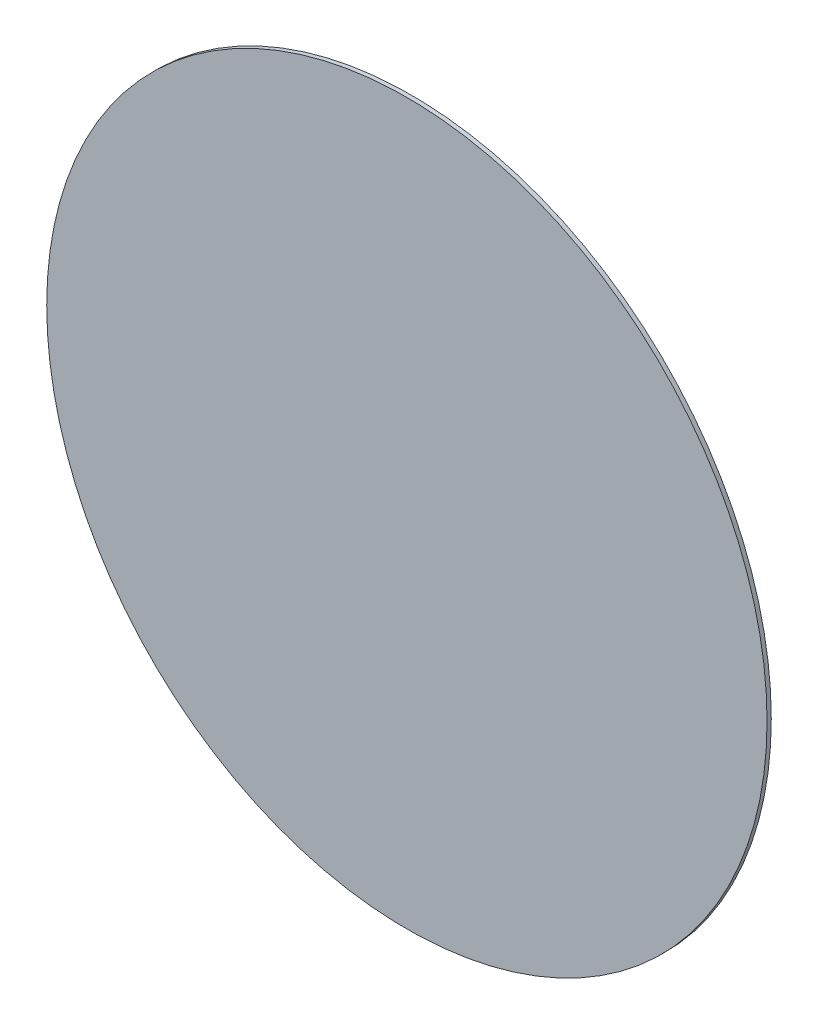
ISO-10303-21;
HEADER;
FILE_DESCRIPTION(('STEP AP214'),'2;1');
FILE_NAME('part.step','',(''),(''),'','','');
FILE_SCHEMA(('AUTOMOTIVE_DESIGN { 1 0 10303 214 1 1 1 1 }'));
ENDSEC;
DATA;
#1=APPLICATION_CONTEXT('core data for automotive mechanical design processes');
#2=APPLICATION_PROTOCOL_DEFINITION('international standard','automotive_design',2000,#1);
#3=PRODUCT_CONTEXT('',#1,'mechanical');
#4=PRODUCT('Part','Part','',(#3));
#5=PRODUCT_RELATED_PRODUCT_CATEGORY('part','',(#4));
#6=PRODUCT_DEFINITION_FORMATION('','',#4);
#7=PRODUCT_DEFINITION_CONTEXT('part definition',#1,'design');
#8=PRODUCT_DEFINITION('design','',#6,#7);
#9=PRODUCT_DEFINITION_SHAPE('','',#8);
#10=(LENGTH_UNIT() NAMED_UNIT(*) SI_UNIT(.MILLI.,.METRE.));
#11=(NAMED_UNIT(*) PLANE_ANGLE_UNIT() SI_UNIT($,.RADIAN.));
#12=(NAMED_UNIT(*) SI_UNIT($,.STERADIAN.) SOLID_ANGLE_UNIT());
#13=UNCERTAINTY_MEASURE_WITH_UNIT(LENGTH_MEASURE(1.E-05),#10,'distance_accuracy_value','');
#14=(GEOMETRIC_REPRESENTATION_CONTEXT(3) GLOBAL_UNCERTAINTY_ASSIGNED_CONTEXT((#13)) GLOBAL_UNIT_ASSIGNED_CONTEXT((#10,
#11,#12)) REPRESENTATION_CONTEXT('',''));
#15=CARTESIAN_POINT('',(0.,0.,0.));
#16=DIRECTION('',(0.,0.,1.));
#17=DIRECTION('',(1.,0.,0.));
#18=AXIS2_PLACEMENT_3D('',#15,#16,#17);
#19=CARTESIAN_POINT('',(0.,0.,3.));
#20=DIRECTION('',(0.,0.,-1.));
#21=DIRECTION('',(-1.,0.,0.));
#22=AXIS2_PLACEMENT_3D('',#19,#20,#21);
#23=CYLINDRICAL_SURFACE('',#22,256.);
#24=CARTESIAN_POINT('',(0.,0.,3.));
#25=DIRECTION('',(0.,0.,1.));
#26=DIRECTION('',(1.,0.,0.));
#27=AXIS2_PLACEMENT_3D('',#24,#25,#26);
#28=CIRCLE('',#27,256.);
#29=CARTESIAN_POINT('',(256.,0.,3.));
#30=VERTEX_POINT('',#29);
#31=EDGE_CURVE('E10',#30,#30,#28,.T.);
#32=ORIENTED_EDGE('',*,*,#31,.F.);
#33=EDGE_LOOP('',(#32));
#34=FACE_BOUND('',#33,.T.);
#35=CARTESIAN_POINT('',(0.,0.,0.));
#36=DIRECTION('',(0.,0.,1.));
#37=DIRECTION('',(1.,0.,0.));
#38=AXIS2_PLACEMENT_3D('',#35,#36,#37);
#39=CIRCLE('',#38,256.);
#40=CARTESIAN_POINT('',(256.,0.,0.));
#41=VERTEX_POINT('',#40);
#42=EDGE_CURVE('E45',#41,#41,#39,.T.);
#43=ORIENTED_EDGE('',*,*,#42,.T.);
#44=EDGE_LOOP('',(#43));
#45=FACE_BOUND('',#44,.T.);
#46=ADVANCED_FACE('F39',(#34,#45),#23,.T.);
#47=CARTESIAN_POINT('',(0.,0.,3.));
#48=DIRECTION('',(0.,0.,1.));
#49=DIRECTION('',(1.,0.,0.));
#50=AXIS2_PLACEMENT_3D('',#47,#48,#49);
#51=PLANE('',#50);
#52=ORIENTED_EDGE('',*,*,#31,.T.);
#53=EDGE_LOOP('',(#52));
#54=FACE_BOUND('',#53,.T.);
#55=ADVANCED_FACE('F53',(#54),#51,.T.);
#56=CARTESIAN_POINT('',(0.,0.,0.));
#57=DIRECTION('',(0.,0.,1.));
#58=DIRECTION('',(1.,0.,0.));
#59=AXIS2_PLACEMENT_3D('',#56,#57,#58);
#60=PLANE('',#59);
#61=ORIENTED_EDGE('',*,*,#42,.F.);
#62=EDGE_LOOP('',(#61));
#63=FACE_BOUND('',#62,.T.);
#64=ADVANCED_FACE('F55',(#63),#60,.F.);
#65=CLOSED_SHELL('',(#46,#55,#64));
#66=MANIFOLD_SOLID_BREP('B2',#65);
#67=ADVANCED_BREP_SHAPE_REPRESENTATION('',(#18,#66),#14);
#68=SHAPE_DEFINITION_REPRESENTATION(#9,#67);
ENDSEC;
END-ISO-10303-21;
